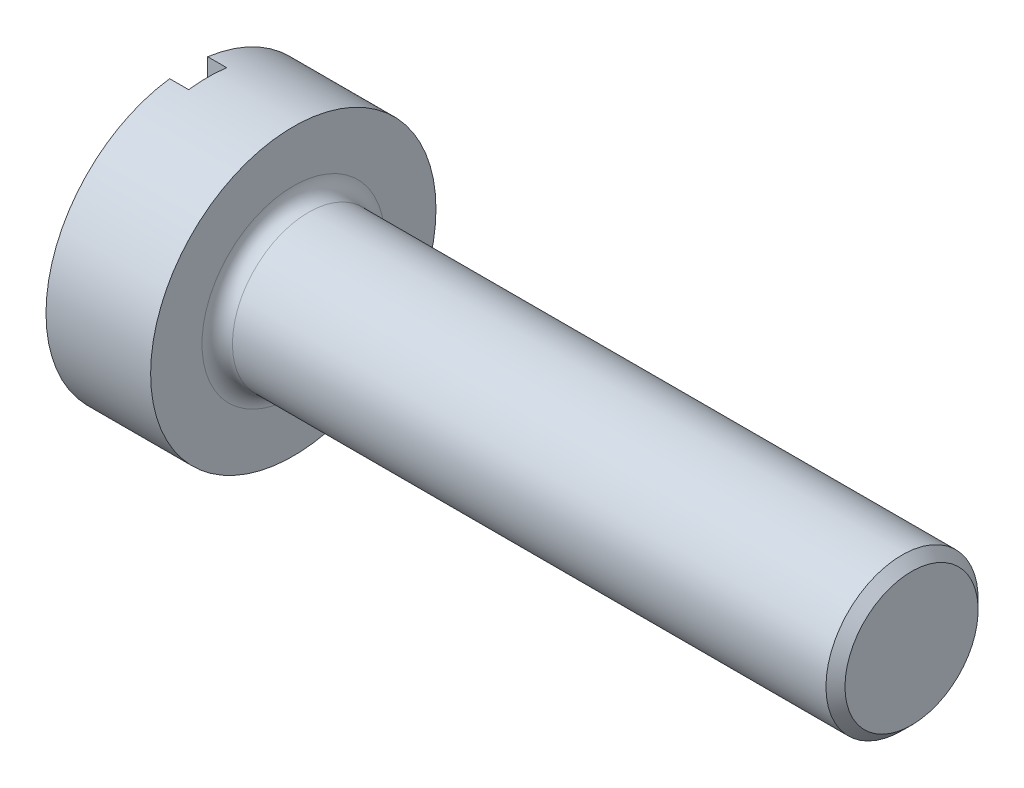
ISO-10303-21;
HEADER;
FILE_DESCRIPTION(('STEP AP214'),'2;1');
FILE_NAME('part.step','',(''),(''),'','','');
FILE_SCHEMA(('AUTOMOTIVE_DESIGN { 1 0 10303 214 1 1 1 1 }'));
ENDSEC;
DATA;
#1=APPLICATION_CONTEXT('core data for automotive mechanical design processes');
#2=APPLICATION_PROTOCOL_DEFINITION('international standard','automotive_design',2000,#1);
#3=PRODUCT_CONTEXT('',#1,'mechanical');
#4=PRODUCT('Part','Part','',(#3));
#5=PRODUCT_RELATED_PRODUCT_CATEGORY('part','',(#4));
#6=PRODUCT_DEFINITION_FORMATION('','',#4);
#7=PRODUCT_DEFINITION_CONTEXT('part definition',#1,'design');
#8=PRODUCT_DEFINITION('design','',#6,#7);
#9=PRODUCT_DEFINITION_SHAPE('','',#8);
#10=(LENGTH_UNIT() NAMED_UNIT(*) SI_UNIT(.MILLI.,.METRE.));
#11=(NAMED_UNIT(*) PLANE_ANGLE_UNIT() SI_UNIT($,.RADIAN.));
#12=(NAMED_UNIT(*) SI_UNIT($,.STERADIAN.) SOLID_ANGLE_UNIT());
#13=UNCERTAINTY_MEASURE_WITH_UNIT(LENGTH_MEASURE(1.E-05),#10,'distance_accuracy_value','');
#14=(GEOMETRIC_REPRESENTATION_CONTEXT(3) GLOBAL_UNCERTAINTY_ASSIGNED_CONTEXT((#13)) GLOBAL_UNIT_ASSIGNED_CONTEXT((#10,
#11,#12)) REPRESENTATION_CONTEXT('',''));
#15=CARTESIAN_POINT('',(0.,0.,0.));
#16=DIRECTION('',(0.,0.,1.));
#17=DIRECTION('',(1.,0.,0.));
#18=AXIS2_PLACEMENT_3D('',#15,#16,#17);
#19=CARTESIAN_POINT('',(0.,0.,0.));
#20=DIRECTION('',(-1.,0.,0.));
#21=DIRECTION('',(0.,0.,1.));
#22=AXIS2_PLACEMENT_3D('',#19,#20,#21);
#23=PLANE('',#22);
#24=CARTESIAN_POINT('',(0.,0.,0.));
#25=DIRECTION('',(-1.,0.,0.));
#26=DIRECTION('',(0.,0.,1.));
#27=AXIS2_PLACEMENT_3D('',#24,#25,#26);
#28=CIRCLE('',#27,1.5);
#29=CARTESIAN_POINT('',(0.,1.48660687473185,-0.2));
#30=VERTEX_POINT('',#29);
#31=CARTESIAN_POINT('',(0.,-1.48660687473185,-0.2));
#32=VERTEX_POINT('',#31);
#33=EDGE_CURVE('E84',#30,#32,#28,.T.);
#34=ORIENTED_EDGE('',*,*,#33,.T.);
#35=DIRECTION('',(0.,1.,0.));
#36=VECTOR('',#35,1.);
#37=CARTESIAN_POINT('',(0.,-1.5,-0.2));
#38=LINE('',#37,#36);
#39=EDGE_CURVE('E50',#32,#30,#38,.T.);
#40=ORIENTED_EDGE('',*,*,#39,.T.);
#41=EDGE_LOOP('',(#34,#40));
#42=FACE_BOUND('',#41,.T.);
#43=ADVANCED_FACE('F35',(#42),#23,.T.);
#44=CARTESIAN_POINT('',(0.,0.,0.));
#45=DIRECTION('',(-1.,0.,0.));
#46=DIRECTION('',(0.,0.,1.));
#47=AXIS2_PLACEMENT_3D('',#44,#45,#46);
#48=CYLINDRICAL_SURFACE('',#47,1.5);
#49=CARTESIAN_POINT('',(1.1,0.,0.));
#50=DIRECTION('',(-1.,0.,0.));
#51=DIRECTION('',(0.,0.,1.));
#52=AXIS2_PLACEMENT_3D('',#49,#50,#51);
#53=CIRCLE('',#52,1.5);
#54=CARTESIAN_POINT('',(1.1,0.,1.5));
#55=VERTEX_POINT('',#54);
#56=EDGE_CURVE('E90',#55,#55,#53,.T.);
#57=ORIENTED_EDGE('',*,*,#56,.T.);
#58=EDGE_LOOP('',(#57));
#59=FACE_BOUND('',#58,.T.);
#60=DIRECTION('',(-1.,0.,0.));
#61=VECTOR('',#60,1.);
#62=CARTESIAN_POINT('',(0.,-1.48660687473185,0.2));
#63=LINE('',#62,#61);
#64=CARTESIAN_POINT('',(0.2,-1.48660687473185,0.2));
#65=VERTEX_POINT('',#64);
#66=CARTESIAN_POINT('',(0.,-1.48660687473185,0.2));
#67=VERTEX_POINT('',#66);
#68=EDGE_CURVE('E11',#65,#67,#63,.T.);
#69=ORIENTED_EDGE('',*,*,#68,.F.);
#70=CARTESIAN_POINT('',(0.2,0.,0.));
#71=DIRECTION('',(-1.,0.,0.));
#72=DIRECTION('',(0.,0.,1.));
#73=AXIS2_PLACEMENT_3D('',#70,#71,#72);
#74=CIRCLE('',#73,1.5);
#75=CARTESIAN_POINT('',(0.2,-1.48660687473185,-0.2));
#76=VERTEX_POINT('',#75);
#77=EDGE_CURVE('E113',#65,#76,#74,.F.);
#78=ORIENTED_EDGE('',*,*,#77,.T.);
#79=DIRECTION('',(-1.,0.,0.));
#80=VECTOR('',#79,1.);
#81=CARTESIAN_POINT('',(0.,-1.48660687473185,-0.2));
#82=LINE('',#81,#80);
#83=EDGE_CURVE('E81',#76,#32,#82,.T.);
#84=ORIENTED_EDGE('',*,*,#83,.T.);
#85=ORIENTED_EDGE('',*,*,#33,.F.);
#86=DIRECTION('',(-1.,0.,0.));
#87=VECTOR('',#86,1.);
#88=CARTESIAN_POINT('',(0.,1.48660687473185,-0.2));
#89=LINE('',#88,#87);
#90=CARTESIAN_POINT('',(0.2,1.48660687473185,-0.2));
#91=VERTEX_POINT('',#90);
#92=EDGE_CURVE('E43',#30,#91,#89,.F.);
#93=ORIENTED_EDGE('',*,*,#92,.T.);
#94=CARTESIAN_POINT('',(0.2,1.48660687473185,0.2));
#95=VERTEX_POINT('',#94);
#96=EDGE_CURVE('E111',#91,#95,#74,.F.);
#97=ORIENTED_EDGE('',*,*,#96,.T.);
#98=DIRECTION('',(-1.,0.,0.));
#99=VECTOR('',#98,1.);
#100=CARTESIAN_POINT('',(0.,1.48660687473185,0.2));
#101=LINE('',#100,#99);
#102=CARTESIAN_POINT('',(0.,1.48660687473185,0.2));
#103=VERTEX_POINT('',#102);
#104=EDGE_CURVE('E58',#103,#95,#101,.F.);
#105=ORIENTED_EDGE('',*,*,#104,.F.);
#106=EDGE_CURVE('E91',#67,#103,#28,.T.);
#107=ORIENTED_EDGE('',*,*,#106,.F.);
#108=EDGE_LOOP('',(#69,#78,#84,#85,#93,#97,#105,#107));
#109=FACE_BOUND('',#108,.T.);
#110=ADVANCED_FACE('F88',(#59,#109),#48,.T.);
#111=DIRECTION('',(0.,1.,0.));
#112=VECTOR('',#111,1.);
#113=CARTESIAN_POINT('',(0.,-1.5,0.2));
#114=LINE('',#113,#112);
#115=EDGE_CURVE('E85',#67,#103,#114,.T.);
#116=ORIENTED_EDGE('',*,*,#115,.F.);
#117=ORIENTED_EDGE('',*,*,#106,.T.);
#118=EDGE_LOOP('',(#116,#117));
#119=FACE_BOUND('',#118,.T.);
#120=ADVANCED_FACE('F123',(#119),#23,.T.);
#121=CARTESIAN_POINT('',(7.6,0.,0.));
#122=DIRECTION('',(-1.,0.,0.));
#123=DIRECTION('',(0.,0.,1.));
#124=AXIS2_PLACEMENT_3D('',#121,#122,#123);
#125=PLANE('',#124);
#126=CARTESIAN_POINT('',(7.6,0.,0.));
#127=DIRECTION('',(-1.,0.,0.));
#128=DIRECTION('',(0.,0.,1.));
#129=AXIS2_PLACEMENT_3D('',#126,#127,#128);
#130=CIRCLE('',#129,0.700000000000001);
#131=CARTESIAN_POINT('',(7.6,0.,0.700000000000001));
#132=VERTEX_POINT('',#131);
#133=EDGE_CURVE('E102',#132,#132,#130,.F.);
#134=ORIENTED_EDGE('',*,*,#133,.T.);
#135=EDGE_LOOP('',(#134));
#136=FACE_BOUND('',#135,.T.);
#137=ADVANCED_FACE('F125',(#136),#125,.F.);
#138=CARTESIAN_POINT('',(0.,0.,0.));
#139=DIRECTION('',(-1.,0.,0.));
#140=DIRECTION('',(0.,0.,1.));
#141=AXIS2_PLACEMENT_3D('',#138,#139,#140);
#142=CYLINDRICAL_SURFACE('',#141,0.8);
#143=CARTESIAN_POINT('',(1.26,0.,0.));
#144=DIRECTION('',(1.,0.,0.));
#145=DIRECTION('',(0.,0.,-1.));
#146=AXIS2_PLACEMENT_3D('',#143,#144,#145);
#147=CIRCLE('',#146,0.8);
#148=CARTESIAN_POINT('',(1.26,0.,-0.8));
#149=VERTEX_POINT('',#148);
#150=EDGE_CURVE('E108',#149,#149,#147,.T.);
#151=ORIENTED_EDGE('',*,*,#150,.T.);
#152=EDGE_LOOP('',(#151));
#153=FACE_BOUND('',#152,.T.);
#154=CARTESIAN_POINT('',(7.5,0.,0.));
#155=DIRECTION('',(-1.,0.,0.));
#156=DIRECTION('',(0.,0.,1.));
#157=AXIS2_PLACEMENT_3D('',#154,#155,#156);
#158=CIRCLE('',#157,0.8);
#159=CARTESIAN_POINT('',(7.5,0.,0.8));
#160=VERTEX_POINT('',#159);
#161=EDGE_CURVE('E94',#160,#160,#158,.T.);
#162=ORIENTED_EDGE('',*,*,#161,.T.);
#163=EDGE_LOOP('',(#162));
#164=FACE_BOUND('',#163,.T.);
#165=ADVANCED_FACE('F131',(#153,#164),#142,.T.);
#166=CARTESIAN_POINT('',(1.1,0.,0.));
#167=DIRECTION('',(1.,0.,0.));
#168=DIRECTION('',(0.,0.,-1.));
#169=AXIS2_PLACEMENT_3D('',#166,#167,#168);
#170=PLANE('',#169);
#171=CARTESIAN_POINT('',(1.1,0.,0.));
#172=DIRECTION('',(1.,0.,0.));
#173=DIRECTION('',(0.,0.,-1.));
#174=AXIS2_PLACEMENT_3D('',#171,#172,#173);
#175=CIRCLE('',#174,0.96);
#176=CARTESIAN_POINT('',(1.1,0.,-0.96));
#177=VERTEX_POINT('',#176);
#178=EDGE_CURVE('E105',#177,#177,#175,.F.);
#179=ORIENTED_EDGE('',*,*,#178,.T.);
#180=EDGE_LOOP('',(#179));
#181=FACE_BOUND('',#180,.T.);
#182=ORIENTED_EDGE('',*,*,#56,.F.);
#183=EDGE_LOOP('',(#182));
#184=FACE_BOUND('',#183,.T.);
#185=ADVANCED_FACE('F181',(#181,#184),#170,.T.);
#186=CARTESIAN_POINT('',(7.5,0.,0.));
#187=DIRECTION('',(-1.,0.,0.));
#188=DIRECTION('',(0.,0.,1.));
#189=AXIS2_PLACEMENT_3D('',#186,#187,#188);
#190=CONICAL_SURFACE('',#189,0.8,0.785398163397446);
#191=ORIENTED_EDGE('',*,*,#133,.F.);
#192=EDGE_LOOP('',(#191));
#193=FACE_BOUND('',#192,.T.);
#194=ORIENTED_EDGE('',*,*,#161,.F.);
#195=EDGE_LOOP('',(#194));
#196=FACE_BOUND('',#195,.T.);
#197=ADVANCED_FACE('F184',(#193,#196),#190,.T.);
#198=CARTESIAN_POINT('',(1.26,0.,0.));
#199=DIRECTION('',(1.,0.,0.));
#200=DIRECTION('',(0.,0.,-1.));
#201=AXIS2_PLACEMENT_3D('',#198,#199,#200);
#202=TOROIDAL_SURFACE('',#201,0.96,0.16);
#203=ORIENTED_EDGE('',*,*,#150,.F.);
#204=EDGE_LOOP('',(#203));
#205=FACE_BOUND('',#204,.T.);
#206=ORIENTED_EDGE('',*,*,#178,.F.);
#207=EDGE_LOOP('',(#206));
#208=FACE_BOUND('',#207,.T.);
#209=ADVANCED_FACE('F37',(#205,#208),#202,.F.);
#210=CARTESIAN_POINT('',(0.2,-1.5,0.));
#211=DIRECTION('',(-1.,0.,0.));
#212=DIRECTION('',(0.,0.,1.));
#213=AXIS2_PLACEMENT_3D('',#210,#211,#212);
#214=PLANE('',#213);
#215=DIRECTION('',(0.,1.,0.));
#216=VECTOR('',#215,1.);
#217=CARTESIAN_POINT('',(0.2,-1.5,0.2));
#218=LINE('',#217,#216);
#219=EDGE_CURVE('E97',#65,#95,#218,.T.);
#220=ORIENTED_EDGE('',*,*,#219,.T.);
#221=ORIENTED_EDGE('',*,*,#96,.F.);
#222=DIRECTION('',(0.,1.,0.));
#223=VECTOR('',#222,1.);
#224=CARTESIAN_POINT('',(0.2,-1.5,-0.2));
#225=LINE('',#224,#223);
#226=EDGE_CURVE('E77',#76,#91,#225,.T.);
#227=ORIENTED_EDGE('',*,*,#226,.F.);
#228=ORIENTED_EDGE('',*,*,#77,.F.);
#229=EDGE_LOOP('',(#220,#221,#227,#228));
#230=FACE_BOUND('',#229,.T.);
#231=ADVANCED_FACE('F117',(#230),#214,.T.);
#232=CARTESIAN_POINT('',(0.,-1.5,0.2));
#233=DIRECTION('',(0.,0.,1.));
#234=DIRECTION('',(1.,0.,0.));
#235=AXIS2_PLACEMENT_3D('',#232,#233,#234);
#236=PLANE('',#235);
#237=ORIENTED_EDGE('',*,*,#104,.T.);
#238=ORIENTED_EDGE('',*,*,#219,.F.);
#239=ORIENTED_EDGE('',*,*,#68,.T.);
#240=ORIENTED_EDGE('',*,*,#115,.T.);
#241=EDGE_LOOP('',(#237,#238,#239,#240));
#242=FACE_BOUND('',#241,.T.);
#243=ADVANCED_FACE('F118',(#242),#236,.F.);
#244=CARTESIAN_POINT('',(0.,-1.5,-0.2));
#245=DIRECTION('',(0.,0.,1.));
#246=DIRECTION('',(1.,0.,0.));
#247=AXIS2_PLACEMENT_3D('',#244,#245,#246);
#248=PLANE('',#247);
#249=ORIENTED_EDGE('',*,*,#39,.F.);
#250=ORIENTED_EDGE('',*,*,#83,.F.);
#251=ORIENTED_EDGE('',*,*,#226,.T.);
#252=ORIENTED_EDGE('',*,*,#92,.F.);
#253=EDGE_LOOP('',(#249,#250,#251,#252));
#254=FACE_BOUND('',#253,.T.);
#255=ADVANCED_FACE('F75',(#254),#248,.T.);
#256=CLOSED_SHELL('',(#43,#110,#120,#137,#165,#185,#197,#209,#231,#243,#255));
#257=MANIFOLD_SOLID_BREP('B2',#256);
#258=ADVANCED_BREP_SHAPE_REPRESENTATION('',(#18,#257),#14);
#259=SHAPE_DEFINITION_REPRESENTATION(#9,#258);
ENDSEC;
END-ISO-10303-21;
